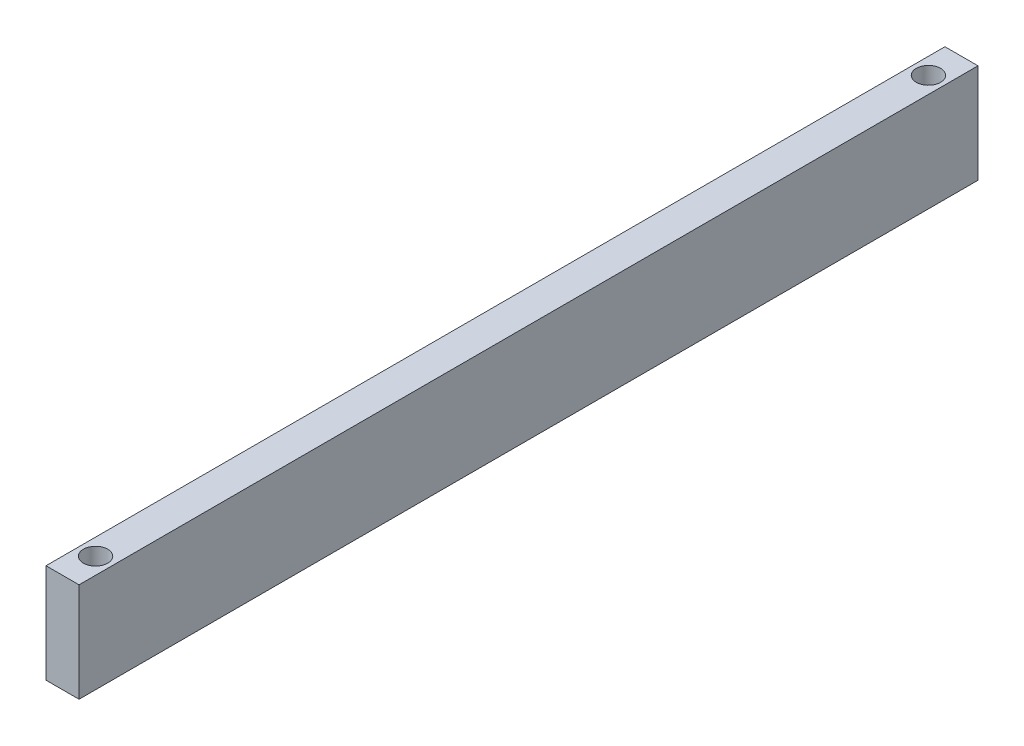
ISO-10303-21;
HEADER;
FILE_DESCRIPTION(('STEP AP214'),'2;1');
FILE_NAME('part.step','',(''),(''),'','','');
FILE_SCHEMA(('AUTOMOTIVE_DESIGN { 1 0 10303 214 1 1 1 1 }'));
ENDSEC;
DATA;
#1=APPLICATION_CONTEXT('core data for automotive mechanical design processes');
#2=APPLICATION_PROTOCOL_DEFINITION('international standard','automotive_design',2000,#1);
#3=PRODUCT_CONTEXT('',#1,'mechanical');
#4=PRODUCT('Part','Part','',(#3));
#5=PRODUCT_RELATED_PRODUCT_CATEGORY('part','',(#4));
#6=PRODUCT_DEFINITION_FORMATION('','',#4);
#7=PRODUCT_DEFINITION_CONTEXT('part definition',#1,'design');
#8=PRODUCT_DEFINITION('design','',#6,#7);
#9=PRODUCT_DEFINITION_SHAPE('','',#8);
#10=(LENGTH_UNIT() NAMED_UNIT(*) SI_UNIT(.MILLI.,.METRE.));
#11=(NAMED_UNIT(*) PLANE_ANGLE_UNIT() SI_UNIT($,.RADIAN.));
#12=(NAMED_UNIT(*) SI_UNIT($,.STERADIAN.) SOLID_ANGLE_UNIT());
#13=UNCERTAINTY_MEASURE_WITH_UNIT(LENGTH_MEASURE(1.E-05),#10,'distance_accuracy_value','');
#14=(GEOMETRIC_REPRESENTATION_CONTEXT(3) GLOBAL_UNCERTAINTY_ASSIGNED_CONTEXT((#13)) GLOBAL_UNIT_ASSIGNED_CONTEXT((#10,
#11,#12)) REPRESENTATION_CONTEXT('',''));
#15=CARTESIAN_POINT('',(0.,0.,0.));
#16=DIRECTION('',(0.,0.,1.));
#17=DIRECTION('',(1.,0.,0.));
#18=AXIS2_PLACEMENT_3D('',#15,#16,#17);
#19=CARTESIAN_POINT('',(0.,0.,172.72));
#20=DIRECTION('',(1.,0.,0.));
#21=DIRECTION('',(0.,1.,0.));
#22=AXIS2_PLACEMENT_3D('',#19,#20,#21);
#23=PLANE('',#22);
#24=DIRECTION('',(0.,-1.,0.));
#25=VECTOR('',#24,1.);
#26=CARTESIAN_POINT('',(0.,0.,0.));
#27=LINE('',#26,#25);
#28=CARTESIAN_POINT('',(0.,19.05,0.));
#29=VERTEX_POINT('',#28);
#30=CARTESIAN_POINT('',(0.,0.,0.));
#31=VERTEX_POINT('',#30);
#32=EDGE_CURVE('E113',#29,#31,#27,.T.);
#33=ORIENTED_EDGE('',*,*,#32,.F.);
#34=DIRECTION('',(0.,0.,-1.));
#35=VECTOR('',#34,1.);
#36=CARTESIAN_POINT('',(0.,19.05,172.72));
#37=LINE('',#36,#35);
#38=CARTESIAN_POINT('',(0.,19.05,172.72));
#39=VERTEX_POINT('',#38);
#40=EDGE_CURVE('E11',#39,#29,#37,.T.);
#41=ORIENTED_EDGE('',*,*,#40,.F.);
#42=DIRECTION('',(0.,-1.,0.));
#43=VECTOR('',#42,1.);
#44=CARTESIAN_POINT('',(0.,0.,172.72));
#45=LINE('',#44,#43);
#46=CARTESIAN_POINT('',(0.,0.,172.72));
#47=VERTEX_POINT('',#46);
#48=EDGE_CURVE('E102',#39,#47,#45,.T.);
#49=ORIENTED_EDGE('',*,*,#48,.T.);
#50=DIRECTION('',(0.,0.,-1.));
#51=VECTOR('',#50,1.);
#52=CARTESIAN_POINT('',(0.,0.,172.72));
#53=LINE('',#52,#51);
#54=EDGE_CURVE('E62',#47,#31,#53,.T.);
#55=ORIENTED_EDGE('',*,*,#54,.T.);
#56=EDGE_LOOP('',(#33,#41,#49,#55));
#57=FACE_BOUND('',#56,.T.);
#58=ADVANCED_FACE('F45',(#57),#23,.T.);
#59=CARTESIAN_POINT('',(0.,19.05,172.72));
#60=DIRECTION('',(0.,1.,0.));
#61=DIRECTION('',(0.,0.,1.));
#62=AXIS2_PLACEMENT_3D('',#59,#60,#61);
#63=PLANE('',#62);
#64=CARTESIAN_POINT('',(-3.17499999999998,19.05,166.37));
#65=DIRECTION('',(0.,1.,0.));
#66=DIRECTION('',(0.,0.,1.));
#67=AXIS2_PLACEMENT_3D('',#64,#65,#66);
#68=CIRCLE('',#67,2.3368);
#69=CARTESIAN_POINT('',(-3.17499999999998,19.05,168.7068));
#70=VERTEX_POINT('',#69);
#71=EDGE_CURVE('E140',#70,#70,#68,.T.);
#72=ORIENTED_EDGE('',*,*,#71,.F.);
#73=EDGE_LOOP('',(#72));
#74=FACE_BOUND('',#73,.T.);
#75=CARTESIAN_POINT('',(-3.175,19.05,6.35));
#76=DIRECTION('',(0.,1.,0.));
#77=DIRECTION('',(0.,0.,1.));
#78=AXIS2_PLACEMENT_3D('',#75,#76,#77);
#79=CIRCLE('',#78,2.3368);
#80=CARTESIAN_POINT('',(-3.175,19.05,8.6868));
#81=VERTEX_POINT('',#80);
#82=EDGE_CURVE('E136',#81,#81,#79,.T.);
#83=ORIENTED_EDGE('',*,*,#82,.F.);
#84=EDGE_LOOP('',(#83));
#85=FACE_BOUND('',#84,.T.);
#86=DIRECTION('',(1.,0.,0.));
#87=VECTOR('',#86,1.);
#88=CARTESIAN_POINT('',(0.,19.05,0.));
#89=LINE('',#88,#87);
#90=CARTESIAN_POINT('',(-6.35,19.05,0.));
#91=VERTEX_POINT('',#90);
#92=EDGE_CURVE('E92',#91,#29,#89,.T.);
#93=ORIENTED_EDGE('',*,*,#92,.F.);
#94=DIRECTION('',(0.,0.,-1.));
#95=VECTOR('',#94,1.);
#96=CARTESIAN_POINT('',(-6.35,19.05,172.72));
#97=LINE('',#96,#95);
#98=CARTESIAN_POINT('',(-6.35,19.05,172.72));
#99=VERTEX_POINT('',#98);
#100=EDGE_CURVE('E54',#99,#91,#97,.T.);
#101=ORIENTED_EDGE('',*,*,#100,.F.);
#102=DIRECTION('',(1.,0.,0.));
#103=VECTOR('',#102,1.);
#104=CARTESIAN_POINT('',(0.,19.05,172.72));
#105=LINE('',#104,#103);
#106=EDGE_CURVE('E90',#99,#39,#105,.T.);
#107=ORIENTED_EDGE('',*,*,#106,.T.);
#108=ORIENTED_EDGE('',*,*,#40,.T.);
#109=EDGE_LOOP('',(#93,#101,#107,#108));
#110=FACE_BOUND('',#109,.T.);
#111=ADVANCED_FACE('F89',(#74,#85,#110),#63,.T.);
#112=CARTESIAN_POINT('',(-6.35,0.,172.72));
#113=DIRECTION('',(-1.,0.,0.));
#114=DIRECTION('',(0.,0.,1.));
#115=AXIS2_PLACEMENT_3D('',#112,#113,#114);
#116=PLANE('',#115);
#117=DIRECTION('',(0.,1.,0.));
#118=VECTOR('',#117,1.);
#119=CARTESIAN_POINT('',(-6.35,0.,0.));
#120=LINE('',#119,#118);
#121=CARTESIAN_POINT('',(-6.35,0.,0.));
#122=VERTEX_POINT('',#121);
#123=EDGE_CURVE('E119',#122,#91,#120,.T.);
#124=ORIENTED_EDGE('',*,*,#123,.F.);
#125=DIRECTION('',(0.,0.,-1.));
#126=VECTOR('',#125,1.);
#127=CARTESIAN_POINT('',(-6.35,0.,172.72));
#128=LINE('',#127,#126);
#129=CARTESIAN_POINT('',(-6.35,0.,172.72));
#130=VERTEX_POINT('',#129);
#131=EDGE_CURVE('E75',#130,#122,#128,.T.);
#132=ORIENTED_EDGE('',*,*,#131,.F.);
#133=DIRECTION('',(0.,1.,0.));
#134=VECTOR('',#133,1.);
#135=CARTESIAN_POINT('',(-6.35,0.,172.72));
#136=LINE('',#135,#134);
#137=EDGE_CURVE('E101',#130,#99,#136,.T.);
#138=ORIENTED_EDGE('',*,*,#137,.T.);
#139=ORIENTED_EDGE('',*,*,#100,.T.);
#140=EDGE_LOOP('',(#124,#132,#138,#139));
#141=FACE_BOUND('',#140,.T.);
#142=ADVANCED_FACE('F105',(#141),#116,.T.);
#143=CARTESIAN_POINT('',(0.,0.,172.72));
#144=DIRECTION('',(0.,-1.,0.));
#145=DIRECTION('',(1.,0.,0.));
#146=AXIS2_PLACEMENT_3D('',#143,#144,#145);
#147=PLANE('',#146);
#148=CARTESIAN_POINT('',(-3.17499999999998,0.,166.37));
#149=DIRECTION('',(0.,1.,0.));
#150=DIRECTION('',(0.,0.,1.));
#151=AXIS2_PLACEMENT_3D('',#148,#149,#150);
#152=CIRCLE('',#151,2.3368);
#153=CARTESIAN_POINT('',(-3.17499999999998,0.,168.7068));
#154=VERTEX_POINT('',#153);
#155=EDGE_CURVE('E116',#154,#154,#152,.T.);
#156=ORIENTED_EDGE('',*,*,#155,.T.);
#157=EDGE_LOOP('',(#156));
#158=FACE_BOUND('',#157,.T.);
#159=CARTESIAN_POINT('',(-3.175,0.,6.35));
#160=DIRECTION('',(0.,1.,0.));
#161=DIRECTION('',(0.,0.,1.));
#162=AXIS2_PLACEMENT_3D('',#159,#160,#161);
#163=CIRCLE('',#162,2.3368);
#164=CARTESIAN_POINT('',(-3.175,0.,8.6868));
#165=VERTEX_POINT('',#164);
#166=EDGE_CURVE('E132',#165,#165,#163,.T.);
#167=ORIENTED_EDGE('',*,*,#166,.T.);
#168=EDGE_LOOP('',(#167));
#169=FACE_BOUND('',#168,.T.);
#170=DIRECTION('',(-1.,0.,0.));
#171=VECTOR('',#170,1.);
#172=CARTESIAN_POINT('',(0.,0.,0.));
#173=LINE('',#172,#171);
#174=EDGE_CURVE('E122',#31,#122,#173,.T.);
#175=ORIENTED_EDGE('',*,*,#174,.F.);
#176=ORIENTED_EDGE('',*,*,#54,.F.);
#177=DIRECTION('',(-1.,0.,0.));
#178=VECTOR('',#177,1.);
#179=CARTESIAN_POINT('',(0.,0.,172.72));
#180=LINE('',#179,#178);
#181=EDGE_CURVE('E107',#47,#130,#180,.T.);
#182=ORIENTED_EDGE('',*,*,#181,.T.);
#183=ORIENTED_EDGE('',*,*,#131,.T.);
#184=EDGE_LOOP('',(#175,#176,#182,#183));
#185=FACE_BOUND('',#184,.T.);
#186=ADVANCED_FACE('F148',(#158,#169,#185),#147,.T.);
#187=CARTESIAN_POINT('',(0.,0.,172.72));
#188=DIRECTION('',(0.,0.,1.));
#189=DIRECTION('',(1.,0.,0.));
#190=AXIS2_PLACEMENT_3D('',#187,#188,#189);
#191=PLANE('',#190);
#192=ORIENTED_EDGE('',*,*,#48,.F.);
#193=ORIENTED_EDGE('',*,*,#106,.F.);
#194=ORIENTED_EDGE('',*,*,#137,.F.);
#195=ORIENTED_EDGE('',*,*,#181,.F.);
#196=EDGE_LOOP('',(#192,#193,#194,#195));
#197=FACE_BOUND('',#196,.T.);
#198=ADVANCED_FACE('F99',(#197),#191,.T.);
#199=CARTESIAN_POINT('',(0.,0.,0.));
#200=DIRECTION('',(0.,0.,1.));
#201=DIRECTION('',(1.,0.,0.));
#202=AXIS2_PLACEMENT_3D('',#199,#200,#201);
#203=PLANE('',#202);
#204=ORIENTED_EDGE('',*,*,#32,.T.);
#205=ORIENTED_EDGE('',*,*,#174,.T.);
#206=ORIENTED_EDGE('',*,*,#123,.T.);
#207=ORIENTED_EDGE('',*,*,#92,.T.);
#208=EDGE_LOOP('',(#204,#205,#206,#207));
#209=FACE_BOUND('',#208,.T.);
#210=ADVANCED_FACE('F163',(#209),#203,.F.);
#211=CARTESIAN_POINT('',(-3.175,0.,6.35));
#212=DIRECTION('',(0.,1.,0.));
#213=DIRECTION('',(0.,0.,1.));
#214=AXIS2_PLACEMENT_3D('',#211,#212,#213);
#215=CYLINDRICAL_SURFACE('',#214,2.3368);
#216=CARTESIAN_POINT('',(-3.175,0.,8.6868));
#217=CARTESIAN_POINT('',(-3.175,0.1984375,8.6868));
#218=CARTESIAN_POINT('',(-3.175,0.396875,8.6868));
#219=CARTESIAN_POINT('',(-3.175,0.79375,8.6868));
#220=CARTESIAN_POINT('',(-3.175,0.9921875,8.6868));
#221=CARTESIAN_POINT('',(-3.175,1.3890625,8.6868));
#222=CARTESIAN_POINT('',(-3.175,1.5875,8.6868));
#223=CARTESIAN_POINT('',(-3.175,1.984375,8.6868));
#224=CARTESIAN_POINT('',(-3.175,2.1828125,8.6868));
#225=CARTESIAN_POINT('',(-3.175,2.5796875,8.6868));
#226=CARTESIAN_POINT('',(-3.175,2.778125,8.6868));
#227=CARTESIAN_POINT('',(-3.175,3.175,8.6868));
#228=CARTESIAN_POINT('',(-3.175,3.3734375,8.6868));
#229=CARTESIAN_POINT('',(-3.175,3.7703125,8.6868));
#230=CARTESIAN_POINT('',(-3.175,3.96875,8.6868));
#231=CARTESIAN_POINT('',(-3.175,4.365625,8.6868));
#232=CARTESIAN_POINT('',(-3.175,4.5640625,8.6868));
#233=CARTESIAN_POINT('',(-3.175,4.9609375,8.6868));
#234=CARTESIAN_POINT('',(-3.175,5.159375,8.6868));
#235=CARTESIAN_POINT('',(-3.175,5.55625,8.6868));
#236=CARTESIAN_POINT('',(-3.175,5.7546875,8.6868));
#237=CARTESIAN_POINT('',(-3.175,6.1515625,8.6868));
#238=CARTESIAN_POINT('',(-3.175,6.35,8.6868));
#239=CARTESIAN_POINT('',(-3.175,6.746875,8.6868));
#240=CARTESIAN_POINT('',(-3.175,6.9453125,8.6868));
#241=CARTESIAN_POINT('',(-3.175,7.3421875,8.6868));
#242=CARTESIAN_POINT('',(-3.175,7.540625,8.6868));
#243=CARTESIAN_POINT('',(-3.175,7.9375,8.6868));
#244=CARTESIAN_POINT('',(-3.175,8.1359375,8.6868));
#245=CARTESIAN_POINT('',(-3.175,8.5328125,8.6868));
#246=CARTESIAN_POINT('',(-3.175,8.73125,8.6868));
#247=CARTESIAN_POINT('',(-3.175,9.128125,8.6868));
#248=CARTESIAN_POINT('',(-3.175,9.3265625,8.6868));
#249=CARTESIAN_POINT('',(-3.175,9.7234375,8.6868));
#250=CARTESIAN_POINT('',(-3.175,9.921875,8.6868));
#251=CARTESIAN_POINT('',(-3.175,10.31875,8.6868));
#252=CARTESIAN_POINT('',(-3.175,10.5171875,8.6868));
#253=CARTESIAN_POINT('',(-3.175,10.9140625,8.6868));
#254=CARTESIAN_POINT('',(-3.175,11.1125,8.6868));
#255=CARTESIAN_POINT('',(-3.175,11.509375,8.6868));
#256=CARTESIAN_POINT('',(-3.175,11.7078125,8.6868));
#257=CARTESIAN_POINT('',(-3.175,12.1046875,8.6868));
#258=CARTESIAN_POINT('',(-3.175,12.303125,8.6868));
#259=CARTESIAN_POINT('',(-3.175,12.7,8.6868));
#260=CARTESIAN_POINT('',(-3.175,12.8984375,8.6868));
#261=CARTESIAN_POINT('',(-3.175,13.2953125,8.6868));
#262=CARTESIAN_POINT('',(-3.175,13.49375,8.6868));
#263=CARTESIAN_POINT('',(-3.175,13.890625,8.6868));
#264=CARTESIAN_POINT('',(-3.175,14.0890625,8.6868));
#265=CARTESIAN_POINT('',(-3.175,14.4859375,8.6868));
#266=CARTESIAN_POINT('',(-3.175,14.684375,8.6868));
#267=CARTESIAN_POINT('',(-3.175,15.08125,8.6868));
#268=CARTESIAN_POINT('',(-3.175,15.2796875,8.6868));
#269=CARTESIAN_POINT('',(-3.175,15.6765625,8.6868));
#270=CARTESIAN_POINT('',(-3.175,15.875,8.6868));
#271=CARTESIAN_POINT('',(-3.175,16.271875,8.6868));
#272=CARTESIAN_POINT('',(-3.175,16.4703125,8.6868));
#273=CARTESIAN_POINT('',(-3.175,16.8671875,8.6868));
#274=CARTESIAN_POINT('',(-3.175,17.065625,8.6868));
#275=CARTESIAN_POINT('',(-3.175,17.4625,8.6868));
#276=CARTESIAN_POINT('',(-3.175,17.6609375,8.6868));
#277=CARTESIAN_POINT('',(-3.175,18.0578125,8.6868));
#278=CARTESIAN_POINT('',(-3.175,18.25625,8.6868));
#279=CARTESIAN_POINT('',(-3.175,18.653125,8.6868));
#280=CARTESIAN_POINT('',(-3.175,18.8515625,8.6868));
#281=CARTESIAN_POINT('',(-3.175,19.05,8.6868));
#282=B_SPLINE_CURVE_WITH_KNOTS('',3,(#216,#217,#218,#219,#220,#221,#222,#223,#224,#225,#226,
#227,#228,#229,#230,#231,#232,#233,#234,#235,#236,#237,#238,#239,#240,#241,#242,#243,#244,#245,
#246,#247,#248,#249,#250,#251,#252,#253,#254,#255,#256,#257,#258,#259,#260,#261,#262,#263,#264,
#265,#266,#267,#268,#269,#270,#271,#272,#273,#274,#275,#276,#277,#278,#279,#280,#281),
.UNSPECIFIED.,.F.,.F.,(4,2,2,2,2,2,2,2,2,2,2,2,2,2,2,2,2,2,2,2,2,2,2,2,2,2,2,2,2,2,2,2,4),(0.,
0.5953125,1.190625,1.7859375,2.38125,2.9765625,3.571875,4.1671875,4.7625,5.3578125,5.953125,
6.5484375,7.14375,7.7390625,8.334375,8.9296875,9.525,10.1203125,10.715625,11.3109375,11.90625,
12.5015625,13.096875,13.6921875,14.2875,14.8828125,15.478125,16.0734375,16.66875,17.2640625,
17.859375,18.4546875,19.05),.UNSPECIFIED.);
#283=EDGE_CURVE('BSEAM154',#165,#81,#282,.T.);
#284=ORIENTED_EDGE('',*,*,#166,.F.);
#285=ORIENTED_EDGE('',*,*,#82,.T.);
#286=ORIENTED_EDGE('',*,*,#283,.T.);
#287=ORIENTED_EDGE('',*,*,#283,.F.);
#288=EDGE_LOOP('',(#284,#286,#285,#287));
#289=FACE_BOUND('',#288,.T.);
#290=ADVANCED_FACE('F154',(#289),#215,.F.);
#291=CARTESIAN_POINT('',(-3.17499999999998,0.,166.37));
#292=DIRECTION('',(0.,1.,0.));
#293=DIRECTION('',(0.,0.,1.));
#294=AXIS2_PLACEMENT_3D('',#291,#292,#293);
#295=CYLINDRICAL_SURFACE('',#294,2.3368);
#296=CARTESIAN_POINT('',(-3.17499999999998,0.,168.7068));
#297=CARTESIAN_POINT('',(-3.17499999999998,0.1984375,168.7068));
#298=CARTESIAN_POINT('',(-3.17499999999998,0.396875,168.7068));
#299=CARTESIAN_POINT('',(-3.17499999999998,0.79375,168.7068));
#300=CARTESIAN_POINT('',(-3.17499999999998,0.9921875,168.7068));
#301=CARTESIAN_POINT('',(-3.17499999999998,1.3890625,168.7068));
#302=CARTESIAN_POINT('',(-3.17499999999998,1.5875,168.7068));
#303=CARTESIAN_POINT('',(-3.17499999999998,1.984375,168.7068));
#304=CARTESIAN_POINT('',(-3.17499999999998,2.1828125,168.7068));
#305=CARTESIAN_POINT('',(-3.17499999999998,2.5796875,168.7068));
#306=CARTESIAN_POINT('',(-3.17499999999998,2.778125,168.7068));
#307=CARTESIAN_POINT('',(-3.17499999999998,3.175,168.7068));
#308=CARTESIAN_POINT('',(-3.17499999999998,3.3734375,168.7068));
#309=CARTESIAN_POINT('',(-3.17499999999998,3.7703125,168.7068));
#310=CARTESIAN_POINT('',(-3.17499999999998,3.96875,168.7068));
#311=CARTESIAN_POINT('',(-3.17499999999998,4.365625,168.7068));
#312=CARTESIAN_POINT('',(-3.17499999999998,4.5640625,168.7068));
#313=CARTESIAN_POINT('',(-3.17499999999998,4.9609375,168.7068));
#314=CARTESIAN_POINT('',(-3.17499999999998,5.159375,168.7068));
#315=CARTESIAN_POINT('',(-3.17499999999998,5.55625,168.7068));
#316=CARTESIAN_POINT('',(-3.17499999999998,5.7546875,168.7068));
#317=CARTESIAN_POINT('',(-3.17499999999998,6.1515625,168.7068));
#318=CARTESIAN_POINT('',(-3.17499999999998,6.35,168.7068));
#319=CARTESIAN_POINT('',(-3.17499999999998,6.746875,168.7068));
#320=CARTESIAN_POINT('',(-3.17499999999998,6.9453125,168.7068));
#321=CARTESIAN_POINT('',(-3.17499999999998,7.3421875,168.7068));
#322=CARTESIAN_POINT('',(-3.17499999999998,7.540625,168.7068));
#323=CARTESIAN_POINT('',(-3.17499999999998,7.9375,168.7068));
#324=CARTESIAN_POINT('',(-3.17499999999998,8.1359375,168.7068));
#325=CARTESIAN_POINT('',(-3.17499999999998,8.5328125,168.7068));
#326=CARTESIAN_POINT('',(-3.17499999999998,8.73125,168.7068));
#327=CARTESIAN_POINT('',(-3.17499999999998,9.128125,168.7068));
#328=CARTESIAN_POINT('',(-3.17499999999998,9.3265625,168.7068));
#329=CARTESIAN_POINT('',(-3.17499999999998,9.7234375,168.7068));
#330=CARTESIAN_POINT('',(-3.17499999999998,9.921875,168.7068));
#331=CARTESIAN_POINT('',(-3.17499999999998,10.31875,168.7068));
#332=CARTESIAN_POINT('',(-3.17499999999998,10.5171875,168.7068));
#333=CARTESIAN_POINT('',(-3.17499999999998,10.9140625,168.7068));
#334=CARTESIAN_POINT('',(-3.17499999999998,11.1125,168.7068));
#335=CARTESIAN_POINT('',(-3.17499999999998,11.509375,168.7068));
#336=CARTESIAN_POINT('',(-3.17499999999998,11.7078125,168.7068));
#337=CARTESIAN_POINT('',(-3.17499999999998,12.1046875,168.7068));
#338=CARTESIAN_POINT('',(-3.17499999999998,12.303125,168.7068));
#339=CARTESIAN_POINT('',(-3.17499999999998,12.7,168.7068));
#340=CARTESIAN_POINT('',(-3.17499999999998,12.8984375,168.7068));
#341=CARTESIAN_POINT('',(-3.17499999999998,13.2953125,168.7068));
#342=CARTESIAN_POINT('',(-3.17499999999998,13.49375,168.7068));
#343=CARTESIAN_POINT('',(-3.17499999999998,13.890625,168.7068));
#344=CARTESIAN_POINT('',(-3.17499999999998,14.0890625,168.7068));
#345=CARTESIAN_POINT('',(-3.17499999999998,14.4859375,168.7068));
#346=CARTESIAN_POINT('',(-3.17499999999998,14.684375,168.7068));
#347=CARTESIAN_POINT('',(-3.17499999999998,15.08125,168.7068));
#348=CARTESIAN_POINT('',(-3.17499999999998,15.2796875,168.7068));
#349=CARTESIAN_POINT('',(-3.17499999999998,15.6765625,168.7068));
#350=CARTESIAN_POINT('',(-3.17499999999998,15.875,168.7068));
#351=CARTESIAN_POINT('',(-3.17499999999998,16.271875,168.7068));
#352=CARTESIAN_POINT('',(-3.17499999999998,16.4703125,168.7068));
#353=CARTESIAN_POINT('',(-3.17499999999998,16.8671875,168.7068));
#354=CARTESIAN_POINT('',(-3.17499999999998,17.065625,168.7068));
#355=CARTESIAN_POINT('',(-3.17499999999998,17.4625,168.7068));
#356=CARTESIAN_POINT('',(-3.17499999999998,17.6609375,168.7068));
#357=CARTESIAN_POINT('',(-3.17499999999998,18.0578125,168.7068));
#358=CARTESIAN_POINT('',(-3.17499999999998,18.25625,168.7068));
#359=CARTESIAN_POINT('',(-3.17499999999998,18.653125,168.7068));
#360=CARTESIAN_POINT('',(-3.17499999999998,18.8515625,168.7068));
#361=CARTESIAN_POINT('',(-3.17499999999998,19.05,168.7068));
#362=B_SPLINE_CURVE_WITH_KNOTS('',3,(#296,#297,#298,#299,#300,#301,#302,#303,#304,#305,#306,
#307,#308,#309,#310,#311,#312,#313,#314,#315,#316,#317,#318,#319,#320,#321,#322,#323,#324,#325,
#326,#327,#328,#329,#330,#331,#332,#333,#334,#335,#336,#337,#338,#339,#340,#341,#342,#343,#344,
#345,#346,#347,#348,#349,#350,#351,#352,#353,#354,#355,#356,#357,#358,#359,#360,#361),
.UNSPECIFIED.,.F.,.F.,(4,2,2,2,2,2,2,2,2,2,2,2,2,2,2,2,2,2,2,2,2,2,2,2,2,2,2,2,2,2,2,2,4),(0.,
0.5953125,1.190625,1.7859375,2.38125,2.9765625,3.571875,4.1671875,4.7625,5.3578125,5.953125,
6.5484375,7.14375,7.7390625,8.334375,8.9296875,9.525,10.1203125,10.715625,11.3109375,11.90625,
12.5015625,13.096875,13.6921875,14.2875,14.8828125,15.478125,16.0734375,16.66875,17.2640625,
17.859375,18.4546875,19.05),.UNSPECIFIED.);
#363=EDGE_CURVE('BSEAM151',#154,#70,#362,.T.);
#364=ORIENTED_EDGE('',*,*,#155,.F.);
#365=ORIENTED_EDGE('',*,*,#71,.T.);
#366=ORIENTED_EDGE('',*,*,#363,.T.);
#367=ORIENTED_EDGE('',*,*,#363,.F.);
#368=EDGE_LOOP('',(#364,#366,#365,#367));
#369=FACE_BOUND('',#368,.T.);
#370=ADVANCED_FACE('F151',(#369),#295,.F.);
#371=CLOSED_SHELL('',(#58,#111,#142,#186,#198,#210,#290,#370));
#372=MANIFOLD_SOLID_BREP('B2',#371);
#373=ADVANCED_BREP_SHAPE_REPRESENTATION('',(#18,#372),#14);
#374=SHAPE_DEFINITION_REPRESENTATION(#9,#373);
ENDSEC;
END-ISO-10303-21;
